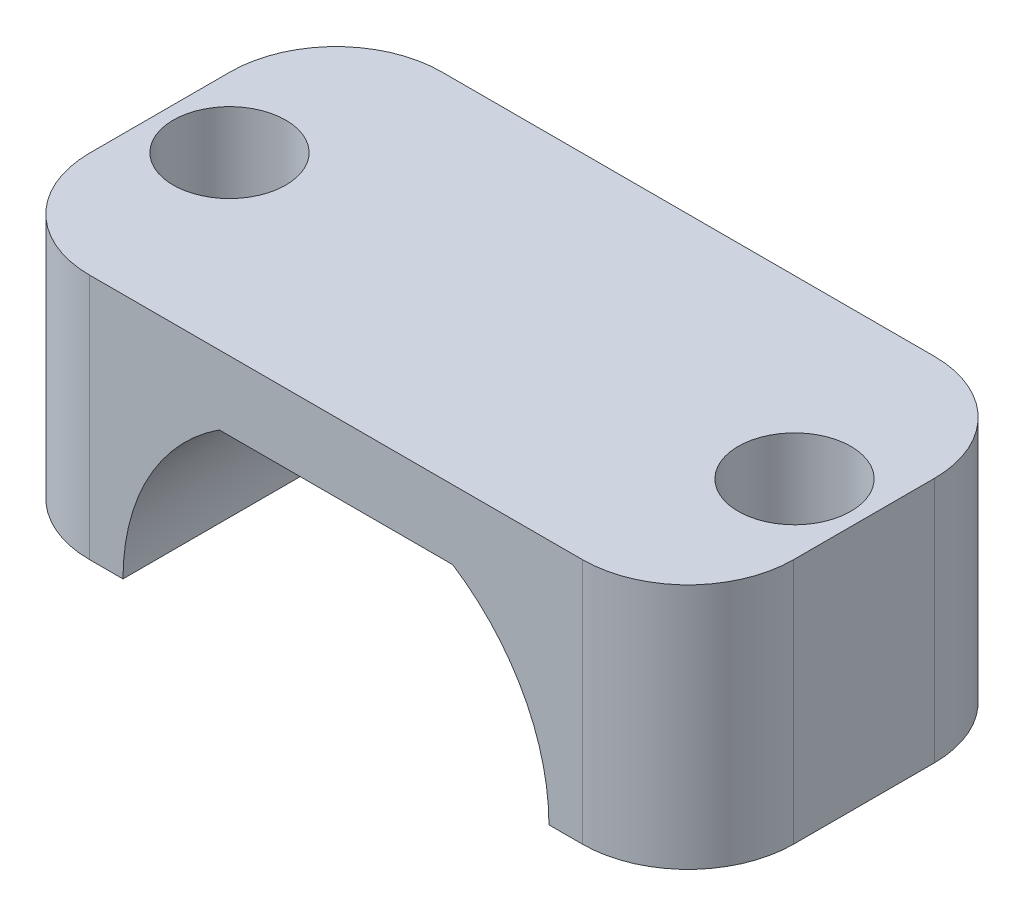
ISO-10303-21;
HEADER;
FILE_DESCRIPTION(('STEP AP214'),'2;1');
FILE_NAME('part.step','',(''),(''),'','','');
FILE_SCHEMA(('AUTOMOTIVE_DESIGN { 1 0 10303 214 1 1 1 1 }'));
ENDSEC;
DATA;
#1=APPLICATION_CONTEXT('core data for automotive mechanical design processes');
#2=APPLICATION_PROTOCOL_DEFINITION('international standard','automotive_design',2000,#1);
#3=PRODUCT_CONTEXT('',#1,'mechanical');
#4=PRODUCT('Part','Part','',(#3));
#5=PRODUCT_RELATED_PRODUCT_CATEGORY('part','',(#4));
#6=PRODUCT_DEFINITION_FORMATION('','',#4);
#7=PRODUCT_DEFINITION_CONTEXT('part definition',#1,'design');
#8=PRODUCT_DEFINITION('design','',#6,#7);
#9=PRODUCT_DEFINITION_SHAPE('','',#8);
#10=(LENGTH_UNIT() NAMED_UNIT(*) SI_UNIT(.MILLI.,.METRE.));
#11=(NAMED_UNIT(*) PLANE_ANGLE_UNIT() SI_UNIT($,.RADIAN.));
#12=(NAMED_UNIT(*) SI_UNIT($,.STERADIAN.) SOLID_ANGLE_UNIT());
#13=UNCERTAINTY_MEASURE_WITH_UNIT(LENGTH_MEASURE(1.E-05),#10,'distance_accuracy_value','');
#14=(GEOMETRIC_REPRESENTATION_CONTEXT(3) GLOBAL_UNCERTAINTY_ASSIGNED_CONTEXT((#13)) GLOBAL_UNIT_ASSIGNED_CONTEXT((#10,
#11,#12)) REPRESENTATION_CONTEXT('',''));
#15=CARTESIAN_POINT('',(0.,0.,0.));
#16=DIRECTION('',(0.,0.,1.));
#17=DIRECTION('',(1.,0.,0.));
#18=AXIS2_PLACEMENT_3D('',#15,#16,#17);
#19=CARTESIAN_POINT('',(10.,0.,5.));
#20=DIRECTION('',(-1.,0.,0.));
#21=DIRECTION('',(0.,-1.,0.));
#22=AXIS2_PLACEMENT_3D('',#19,#20,#21);
#23=PLANE('',#22);
#24=DIRECTION('',(0.,0.,-1.));
#25=VECTOR('',#24,1.);
#26=CARTESIAN_POINT('',(10.,-7.,5.));
#27=LINE('',#26,#25);
#28=CARTESIAN_POINT('',(10.,-7.,2.));
#29=VERTEX_POINT('',#28);
#30=CARTESIAN_POINT('',(10.,-7.,-2.));
#31=VERTEX_POINT('',#30);
#32=EDGE_CURVE('E167',#29,#31,#27,.T.);
#33=ORIENTED_EDGE('',*,*,#32,.T.);
#34=DIRECTION('',(0.,1.,0.));
#35=VECTOR('',#34,1.);
#36=CARTESIAN_POINT('',(10.,0.,-2.));
#37=LINE('',#36,#35);
#38=CARTESIAN_POINT('',(10.,0.,-2.));
#39=VERTEX_POINT('',#38);
#40=EDGE_CURVE('E214',#31,#39,#37,.T.);
#41=ORIENTED_EDGE('',*,*,#40,.T.);
#42=DIRECTION('',(0.,0.,-1.));
#43=VECTOR('',#42,1.);
#44=CARTESIAN_POINT('',(10.,0.,5.));
#45=LINE('',#44,#43);
#46=CARTESIAN_POINT('',(10.,0.,2.));
#47=VERTEX_POINT('',#46);
#48=EDGE_CURVE('E207',#47,#39,#45,.T.);
#49=ORIENTED_EDGE('',*,*,#48,.F.);
#50=DIRECTION('',(0.,1.,0.));
#51=VECTOR('',#50,1.);
#52=CARTESIAN_POINT('',(10.,-7.,2.));
#53=LINE('',#52,#51);
#54=EDGE_CURVE('E211',#47,#29,#53,.F.);
#55=ORIENTED_EDGE('',*,*,#54,.T.);
#56=EDGE_LOOP('',(#33,#41,#49,#55));
#57=FACE_BOUND('',#56,.T.);
#58=ADVANCED_FACE('F39',(#57),#23,.F.);
#59=CARTESIAN_POINT('',(-10.,0.,5.));
#60=DIRECTION('',(0.,-1.,0.));
#61=DIRECTION('',(0.,0.,-1.));
#62=AXIS2_PLACEMENT_3D('',#59,#60,#61);
#63=PLANE('',#62);
#64=CARTESIAN_POINT('',(8.025,0.,0.));
#65=DIRECTION('',(0.,-1.,0.));
#66=DIRECTION('',(0.,0.,-1.));
#67=AXIS2_PLACEMENT_3D('',#64,#65,#66);
#68=CIRCLE('',#67,1.6);
#69=CARTESIAN_POINT('',(8.025,0.,-1.6));
#70=VERTEX_POINT('',#69);
#71=EDGE_CURVE('E172',#70,#70,#68,.T.);
#72=ORIENTED_EDGE('',*,*,#71,.T.);
#73=EDGE_LOOP('',(#72));
#74=FACE_BOUND('',#73,.T.);
#75=CARTESIAN_POINT('',(-8.025,0.,0.));
#76=DIRECTION('',(0.,-1.,0.));
#77=DIRECTION('',(0.,0.,-1.));
#78=AXIS2_PLACEMENT_3D('',#75,#76,#77);
#79=CIRCLE('',#78,1.6);
#80=CARTESIAN_POINT('',(-8.025,0.,-1.6));
#81=VERTEX_POINT('',#80);
#82=EDGE_CURVE('E327',#81,#81,#79,.T.);
#83=ORIENTED_EDGE('',*,*,#82,.T.);
#84=EDGE_LOOP('',(#83));
#85=FACE_BOUND('',#84,.T.);
#86=ORIENTED_EDGE('',*,*,#48,.T.);
#87=CARTESIAN_POINT('',(7.,0.,-2.));
#88=DIRECTION('',(0.,-1.,0.));
#89=DIRECTION('',(0.,0.,-1.));
#90=AXIS2_PLACEMENT_3D('',#87,#88,#89);
#91=CIRCLE('',#90,3.);
#92=CARTESIAN_POINT('',(7.,0.,-5.));
#93=VERTEX_POINT('',#92);
#94=EDGE_CURVE('E227',#39,#93,#91,.F.);
#95=ORIENTED_EDGE('',*,*,#94,.T.);
#96=DIRECTION('',(-1.,0.,0.));
#97=VECTOR('',#96,1.);
#98=CARTESIAN_POINT('',(-10.,0.,-5.));
#99=LINE('',#98,#97);
#100=CARTESIAN_POINT('',(-7.,0.,-5.));
#101=VERTEX_POINT('',#100);
#102=EDGE_CURVE('E168',#93,#101,#99,.T.);
#103=ORIENTED_EDGE('',*,*,#102,.T.);
#104=CARTESIAN_POINT('',(-7.,0.,-2.));
#105=DIRECTION('',(0.,-1.,0.));
#106=DIRECTION('',(0.,0.,-1.));
#107=AXIS2_PLACEMENT_3D('',#104,#105,#106);
#108=CIRCLE('',#107,3.);
#109=CARTESIAN_POINT('',(-10.,0.,-2.));
#110=VERTEX_POINT('',#109);
#111=EDGE_CURVE('E221',#101,#110,#108,.F.);
#112=ORIENTED_EDGE('',*,*,#111,.T.);
#113=DIRECTION('',(0.,0.,-1.));
#114=VECTOR('',#113,1.);
#115=CARTESIAN_POINT('',(-10.,0.,5.));
#116=LINE('',#115,#114);
#117=CARTESIAN_POINT('',(-10.,0.,2.));
#118=VERTEX_POINT('',#117);
#119=EDGE_CURVE('E203',#118,#110,#116,.T.);
#120=ORIENTED_EDGE('',*,*,#119,.F.);
#121=CARTESIAN_POINT('',(-7.,0.,2.));
#122=DIRECTION('',(0.,-1.,0.));
#123=DIRECTION('',(0.,0.,-1.));
#124=AXIS2_PLACEMENT_3D('',#121,#122,#123);
#125=CIRCLE('',#124,3.);
#126=CARTESIAN_POINT('',(-7.,0.,5.));
#127=VERTEX_POINT('',#126);
#128=EDGE_CURVE('E218',#118,#127,#125,.F.);
#129=ORIENTED_EDGE('',*,*,#128,.T.);
#130=DIRECTION('',(-1.,0.,0.));
#131=VECTOR('',#130,1.);
#132=CARTESIAN_POINT('',(-10.,0.,5.));
#133=LINE('',#132,#131);
#134=CARTESIAN_POINT('',(7.,0.,5.));
#135=VERTEX_POINT('',#134);
#136=EDGE_CURVE('E138',#135,#127,#133,.T.);
#137=ORIENTED_EDGE('',*,*,#136,.F.);
#138=CARTESIAN_POINT('',(7.,0.,2.));
#139=DIRECTION('',(0.,-1.,0.));
#140=DIRECTION('',(0.,0.,-1.));
#141=AXIS2_PLACEMENT_3D('',#138,#139,#140);
#142=CIRCLE('',#141,3.);
#143=EDGE_CURVE('E224',#135,#47,#142,.F.);
#144=ORIENTED_EDGE('',*,*,#143,.T.);
#145=EDGE_LOOP('',(#86,#95,#103,#112,#120,#129,#137,#144));
#146=FACE_BOUND('',#145,.T.);
#147=ADVANCED_FACE('F265',(#74,#85,#146),#63,.F.);
#148=CARTESIAN_POINT('',(-10.,-7.,5.));
#149=DIRECTION('',(1.,0.,0.));
#150=DIRECTION('',(0.,1.,0.));
#151=AXIS2_PLACEMENT_3D('',#148,#149,#150);
#152=PLANE('',#151);
#153=ORIENTED_EDGE('',*,*,#119,.T.);
#154=DIRECTION('',(0.,-1.,0.));
#155=VECTOR('',#154,1.);
#156=CARTESIAN_POINT('',(-10.,-7.,-2.));
#157=LINE('',#156,#155);
#158=CARTESIAN_POINT('',(-10.,-7.,-2.));
#159=VERTEX_POINT('',#158);
#160=EDGE_CURVE('E251',#110,#159,#157,.T.);
#161=ORIENTED_EDGE('',*,*,#160,.T.);
#162=DIRECTION('',(0.,0.,-1.));
#163=VECTOR('',#162,1.);
#164=CARTESIAN_POINT('',(-10.,-7.,5.));
#165=LINE('',#164,#163);
#166=CARTESIAN_POINT('',(-10.,-7.,2.));
#167=VERTEX_POINT('',#166);
#168=EDGE_CURVE('E148',#167,#159,#165,.T.);
#169=ORIENTED_EDGE('',*,*,#168,.F.);
#170=DIRECTION('',(0.,-1.,0.));
#171=VECTOR('',#170,1.);
#172=CARTESIAN_POINT('',(-10.,0.,2.));
#173=LINE('',#172,#171);
#174=EDGE_CURVE('E248',#167,#118,#173,.F.);
#175=ORIENTED_EDGE('',*,*,#174,.T.);
#176=EDGE_LOOP('',(#153,#161,#169,#175));
#177=FACE_BOUND('',#176,.T.);
#178=ADVANCED_FACE('F255',(#177),#152,.F.);
#179=CARTESIAN_POINT('',(-6.05,-7.,5.));
#180=DIRECTION('',(0.,1.,0.));
#181=DIRECTION('',(0.,0.,1.));
#182=AXIS2_PLACEMENT_3D('',#179,#180,#181);
#183=PLANE('',#182);
#184=CARTESIAN_POINT('',(-8.025,-7.,0.));
#185=DIRECTION('',(0.,-1.,0.));
#186=DIRECTION('',(0.,0.,-1.));
#187=AXIS2_PLACEMENT_3D('',#184,#185,#186);
#188=CIRCLE('',#187,1.6);
#189=CARTESIAN_POINT('',(-8.025,-7.,-1.6));
#190=VERTEX_POINT('',#189);
#191=EDGE_CURVE('E323',#190,#190,#188,.T.);
#192=ORIENTED_EDGE('',*,*,#191,.F.);
#193=EDGE_LOOP('',(#192));
#194=FACE_BOUND('',#193,.T.);
#195=ORIENTED_EDGE('',*,*,#168,.T.);
#196=CARTESIAN_POINT('',(-7.,-7.,-2.));
#197=DIRECTION('',(0.,1.,0.));
#198=DIRECTION('',(0.,0.,1.));
#199=AXIS2_PLACEMENT_3D('',#196,#197,#198);
#200=CIRCLE('',#199,3.);
#201=CARTESIAN_POINT('',(-7.,-7.,-5.));
#202=VERTEX_POINT('',#201);
#203=EDGE_CURVE('E11',#159,#202,#200,.F.);
#204=ORIENTED_EDGE('',*,*,#203,.T.);
#205=DIRECTION('',(1.,0.,0.));
#206=VECTOR('',#205,1.);
#207=CARTESIAN_POINT('',(-6.05,-7.,-5.));
#208=LINE('',#207,#206);
#209=CARTESIAN_POINT('',(-6.05,-7.,-5.));
#210=VERTEX_POINT('',#209);
#211=EDGE_CURVE('E144',#202,#210,#208,.T.);
#212=ORIENTED_EDGE('',*,*,#211,.T.);
#213=DIRECTION('',(0.,0.,-1.));
#214=VECTOR('',#213,1.);
#215=CARTESIAN_POINT('',(-6.05,-7.,5.));
#216=LINE('',#215,#214);
#217=CARTESIAN_POINT('',(-6.05,-7.,5.));
#218=VERTEX_POINT('',#217);
#219=EDGE_CURVE('E141',#218,#210,#216,.T.);
#220=ORIENTED_EDGE('',*,*,#219,.F.);
#221=DIRECTION('',(1.,0.,0.));
#222=VECTOR('',#221,1.);
#223=CARTESIAN_POINT('',(-6.05,-7.,5.));
#224=LINE('',#223,#222);
#225=CARTESIAN_POINT('',(-7.,-7.,5.));
#226=VERTEX_POINT('',#225);
#227=EDGE_CURVE('E127',#226,#218,#224,.T.);
#228=ORIENTED_EDGE('',*,*,#227,.F.);
#229=CARTESIAN_POINT('',(-7.,-7.,2.));
#230=DIRECTION('',(0.,1.,0.));
#231=DIRECTION('',(0.,0.,1.));
#232=AXIS2_PLACEMENT_3D('',#229,#230,#231);
#233=CIRCLE('',#232,3.);
#234=EDGE_CURVE('E48',#226,#167,#233,.F.);
#235=ORIENTED_EDGE('',*,*,#234,.T.);
#236=EDGE_LOOP('',(#195,#204,#212,#220,#228,#235));
#237=FACE_BOUND('',#236,.T.);
#238=ADVANCED_FACE('F142',(#194,#237),#183,.F.);
#239=CARTESIAN_POINT('',(-0.0499999999999997,-7.,5.));
#240=DIRECTION('',(0.,0.,-1.));
#241=DIRECTION('',(-1.,0.,0.));
#242=AXIS2_PLACEMENT_3D('',#239,#240,#241);
#243=CYLINDRICAL_SURFACE('',#242,6.);
#244=CARTESIAN_POINT('',(-0.0499999999999997,-7.,-5.));
#245=DIRECTION('',(0.,0.,-1.));
#246=DIRECTION('',(1.,0.,0.));
#247=AXIS2_PLACEMENT_3D('',#244,#245,#246);
#248=CIRCLE('',#247,6.);
#249=CARTESIAN_POINT('',(-3.315,-1.96613716913144,-5.));
#250=VERTEX_POINT('',#249);
#251=EDGE_CURVE('E175',#210,#250,#248,.T.);
#252=ORIENTED_EDGE('',*,*,#251,.T.);
#253=DIRECTION('',(0.,0.,-1.));
#254=VECTOR('',#253,1.);
#255=CARTESIAN_POINT('',(-3.315,-1.96613716913144,5.));
#256=LINE('',#255,#254);
#257=CARTESIAN_POINT('',(-3.315,-1.96613716913144,5.));
#258=VERTEX_POINT('',#257);
#259=EDGE_CURVE('E149',#258,#250,#256,.T.);
#260=ORIENTED_EDGE('',*,*,#259,.F.);
#261=CARTESIAN_POINT('',(-0.0499999999999997,-7.,5.));
#262=DIRECTION('',(0.,0.,-1.));
#263=DIRECTION('',(1.,0.,0.));
#264=AXIS2_PLACEMENT_3D('',#261,#262,#263);
#265=CIRCLE('',#264,6.);
#266=EDGE_CURVE('E132',#218,#258,#265,.T.);
#267=ORIENTED_EDGE('',*,*,#266,.F.);
#268=ORIENTED_EDGE('',*,*,#219,.T.);
#269=EDGE_LOOP('',(#252,#260,#267,#268));
#270=FACE_BOUND('',#269,.T.);
#271=ADVANCED_FACE('F151',(#270),#243,.F.);
#272=CARTESIAN_POINT('',(3.315,-1.96613716913144,5.));
#273=DIRECTION('',(0.,1.,0.));
#274=DIRECTION('',(0.,0.,1.));
#275=AXIS2_PLACEMENT_3D('',#272,#273,#274);
#276=PLANE('',#275);
#277=DIRECTION('',(1.,0.,0.));
#278=VECTOR('',#277,1.);
#279=CARTESIAN_POINT('',(3.315,-1.96613716913144,-5.));
#280=LINE('',#279,#278);
#281=CARTESIAN_POINT('',(3.315,-1.96613716913144,-5.));
#282=VERTEX_POINT('',#281);
#283=EDGE_CURVE('E178',#250,#282,#280,.T.);
#284=ORIENTED_EDGE('',*,*,#283,.T.);
#285=DIRECTION('',(0.,0.,-1.));
#286=VECTOR('',#285,1.);
#287=CARTESIAN_POINT('',(3.315,-1.96613716913144,5.));
#288=LINE('',#287,#286);
#289=CARTESIAN_POINT('',(3.315,-1.96613716913144,5.));
#290=VERTEX_POINT('',#289);
#291=EDGE_CURVE('E195',#290,#282,#288,.T.);
#292=ORIENTED_EDGE('',*,*,#291,.F.);
#293=DIRECTION('',(1.,0.,0.));
#294=VECTOR('',#293,1.);
#295=CARTESIAN_POINT('',(3.315,-1.96613716913144,5.));
#296=LINE('',#295,#294);
#297=EDGE_CURVE('E155',#258,#290,#296,.T.);
#298=ORIENTED_EDGE('',*,*,#297,.F.);
#299=ORIENTED_EDGE('',*,*,#259,.T.);
#300=EDGE_LOOP('',(#284,#292,#298,#299));
#301=FACE_BOUND('',#300,.T.);
#302=ADVANCED_FACE('F292',(#301),#276,.F.);
#303=CARTESIAN_POINT('',(0.0499999999999997,-7.,5.));
#304=DIRECTION('',(0.,0.,-1.));
#305=DIRECTION('',(-1.,0.,0.));
#306=AXIS2_PLACEMENT_3D('',#303,#304,#305);
#307=CYLINDRICAL_SURFACE('',#306,6.);
#308=CARTESIAN_POINT('',(0.0499999999999997,-7.,-5.));
#309=DIRECTION('',(0.,0.,-1.));
#310=DIRECTION('',(1.,0.,0.));
#311=AXIS2_PLACEMENT_3D('',#308,#309,#310);
#312=CIRCLE('',#311,6.);
#313=CARTESIAN_POINT('',(6.05,-7.,-5.));
#314=VERTEX_POINT('',#313);
#315=EDGE_CURVE('E181',#282,#314,#312,.T.);
#316=ORIENTED_EDGE('',*,*,#315,.T.);
#317=DIRECTION('',(0.,0.,-1.));
#318=VECTOR('',#317,1.);
#319=CARTESIAN_POINT('',(6.05,-7.,5.));
#320=LINE('',#319,#318);
#321=CARTESIAN_POINT('',(6.05,-7.,5.));
#322=VERTEX_POINT('',#321);
#323=EDGE_CURVE('E191',#322,#314,#320,.T.);
#324=ORIENTED_EDGE('',*,*,#323,.F.);
#325=CARTESIAN_POINT('',(0.0499999999999997,-7.,5.));
#326=DIRECTION('',(0.,0.,-1.));
#327=DIRECTION('',(1.,0.,0.));
#328=AXIS2_PLACEMENT_3D('',#325,#326,#327);
#329=CIRCLE('',#328,6.);
#330=EDGE_CURVE('E158',#290,#322,#329,.T.);
#331=ORIENTED_EDGE('',*,*,#330,.F.);
#332=ORIENTED_EDGE('',*,*,#291,.T.);
#333=EDGE_LOOP('',(#316,#324,#331,#332));
#334=FACE_BOUND('',#333,.T.);
#335=ADVANCED_FACE('F289',(#334),#307,.F.);
#336=CARTESIAN_POINT('',(10.,-7.,5.));
#337=DIRECTION('',(0.,1.,0.));
#338=DIRECTION('',(0.,0.,1.));
#339=AXIS2_PLACEMENT_3D('',#336,#337,#338);
#340=PLANE('',#339);
#341=CARTESIAN_POINT('',(8.025,-7.,0.));
#342=DIRECTION('',(0.,-1.,0.));
#343=DIRECTION('',(0.,0.,-1.));
#344=AXIS2_PLACEMENT_3D('',#341,#342,#343);
#345=CIRCLE('',#344,1.6);
#346=CARTESIAN_POINT('',(8.025,-7.,-1.6));
#347=VERTEX_POINT('',#346);
#348=EDGE_CURVE('E331',#347,#347,#345,.T.);
#349=ORIENTED_EDGE('',*,*,#348,.F.);
#350=EDGE_LOOP('',(#349));
#351=FACE_BOUND('',#350,.T.);
#352=DIRECTION('',(1.,0.,0.));
#353=VECTOR('',#352,1.);
#354=CARTESIAN_POINT('',(10.,-7.,-5.));
#355=LINE('',#354,#353);
#356=CARTESIAN_POINT('',(7.,-7.,-5.));
#357=VERTEX_POINT('',#356);
#358=EDGE_CURVE('E184',#314,#357,#355,.T.);
#359=ORIENTED_EDGE('',*,*,#358,.T.);
#360=CARTESIAN_POINT('',(7.,-7.,-2.));
#361=DIRECTION('',(0.,1.,0.));
#362=DIRECTION('',(0.,0.,1.));
#363=AXIS2_PLACEMENT_3D('',#360,#361,#362);
#364=CIRCLE('',#363,3.);
#365=EDGE_CURVE('E239',#357,#31,#364,.F.);
#366=ORIENTED_EDGE('',*,*,#365,.T.);
#367=ORIENTED_EDGE('',*,*,#32,.F.);
#368=CARTESIAN_POINT('',(7.,-7.,2.));
#369=DIRECTION('',(0.,1.,0.));
#370=DIRECTION('',(0.,0.,1.));
#371=AXIS2_PLACEMENT_3D('',#368,#369,#370);
#372=CIRCLE('',#371,3.);
#373=CARTESIAN_POINT('',(7.,-7.,5.));
#374=VERTEX_POINT('',#373);
#375=EDGE_CURVE('E236',#29,#374,#372,.F.);
#376=ORIENTED_EDGE('',*,*,#375,.T.);
#377=DIRECTION('',(1.,0.,0.));
#378=VECTOR('',#377,1.);
#379=CARTESIAN_POINT('',(10.,-7.,5.));
#380=LINE('',#379,#378);
#381=EDGE_CURVE('E164',#322,#374,#380,.T.);
#382=ORIENTED_EDGE('',*,*,#381,.F.);
#383=ORIENTED_EDGE('',*,*,#323,.T.);
#384=EDGE_LOOP('',(#359,#366,#367,#376,#382,#383));
#385=FACE_BOUND('',#384,.T.);
#386=ADVANCED_FACE('F275',(#351,#385),#340,.F.);
#387=CARTESIAN_POINT('',(0.0499999999999997,-7.,5.));
#388=DIRECTION('',(0.,0.,1.));
#389=DIRECTION('',(1.,0.,0.));
#390=AXIS2_PLACEMENT_3D('',#387,#388,#389);
#391=PLANE('',#390);
#392=ORIENTED_EDGE('',*,*,#381,.T.);
#393=DIRECTION('',(0.,1.,0.));
#394=VECTOR('',#393,1.);
#395=CARTESIAN_POINT('',(7.,0.,5.));
#396=LINE('',#395,#394);
#397=EDGE_CURVE('E244',#374,#135,#396,.T.);
#398=ORIENTED_EDGE('',*,*,#397,.T.);
#399=ORIENTED_EDGE('',*,*,#136,.T.);
#400=DIRECTION('',(0.,-1.,0.));
#401=VECTOR('',#400,1.);
#402=CARTESIAN_POINT('',(-7.,-7.,5.));
#403=LINE('',#402,#401);
#404=EDGE_CURVE('E136',#127,#226,#403,.T.);
#405=ORIENTED_EDGE('',*,*,#404,.T.);
#406=ORIENTED_EDGE('',*,*,#227,.T.);
#407=ORIENTED_EDGE('',*,*,#266,.T.);
#408=ORIENTED_EDGE('',*,*,#297,.T.);
#409=ORIENTED_EDGE('',*,*,#330,.T.);
#410=EDGE_LOOP('',(#392,#398,#399,#405,#406,#407,#408,#409));
#411=FACE_BOUND('',#410,.T.);
#412=ADVANCED_FACE('F130',(#411),#391,.T.);
#413=CARTESIAN_POINT('',(0.0499999999999997,-7.,-5.));
#414=DIRECTION('',(0.,0.,1.));
#415=DIRECTION('',(1.,0.,0.));
#416=AXIS2_PLACEMENT_3D('',#413,#414,#415);
#417=PLANE('',#416);
#418=ORIENTED_EDGE('',*,*,#102,.F.);
#419=DIRECTION('',(0.,1.,0.));
#420=VECTOR('',#419,1.);
#421=CARTESIAN_POINT('',(7.,-7.,-5.));
#422=LINE('',#421,#420);
#423=EDGE_CURVE('E233',#93,#357,#422,.F.);
#424=ORIENTED_EDGE('',*,*,#423,.T.);
#425=ORIENTED_EDGE('',*,*,#358,.F.);
#426=ORIENTED_EDGE('',*,*,#315,.F.);
#427=ORIENTED_EDGE('',*,*,#283,.F.);
#428=ORIENTED_EDGE('',*,*,#251,.F.);
#429=ORIENTED_EDGE('',*,*,#211,.F.);
#430=DIRECTION('',(0.,-1.,0.));
#431=VECTOR('',#430,1.);
#432=CARTESIAN_POINT('',(-7.,-7.,-5.));
#433=LINE('',#432,#431);
#434=EDGE_CURVE('E230',#202,#101,#433,.F.);
#435=ORIENTED_EDGE('',*,*,#434,.T.);
#436=EDGE_LOOP('',(#418,#424,#425,#426,#427,#428,#429,#435));
#437=FACE_BOUND('',#436,.T.);
#438=ADVANCED_FACE('F261',(#437),#417,.F.);
#439=CARTESIAN_POINT('',(8.025,0.,0.));
#440=DIRECTION('',(0.,-1.,0.));
#441=DIRECTION('',(0.,0.,-1.));
#442=AXIS2_PLACEMENT_3D('',#439,#440,#441);
#443=CYLINDRICAL_SURFACE('',#442,1.6);
#444=ORIENTED_EDGE('',*,*,#71,.F.);
#445=EDGE_LOOP('',(#444));
#446=FACE_BOUND('',#445,.T.);
#447=ORIENTED_EDGE('',*,*,#348,.T.);
#448=EDGE_LOOP('',(#447));
#449=FACE_BOUND('',#448,.T.);
#450=ADVANCED_FACE('F340',(#446,#449),#443,.F.);
#451=CARTESIAN_POINT('',(-8.025,0.,0.));
#452=DIRECTION('',(0.,-1.,0.));
#453=DIRECTION('',(0.,0.,-1.));
#454=AXIS2_PLACEMENT_3D('',#451,#452,#453);
#455=CYLINDRICAL_SURFACE('',#454,1.6);
#456=ORIENTED_EDGE('',*,*,#82,.F.);
#457=EDGE_LOOP('',(#456));
#458=FACE_BOUND('',#457,.T.);
#459=ORIENTED_EDGE('',*,*,#191,.T.);
#460=EDGE_LOOP('',(#459));
#461=FACE_BOUND('',#460,.T.);
#462=ADVANCED_FACE('F312',(#458,#461),#455,.F.);
#463=CARTESIAN_POINT('',(7.,0.,-2.));
#464=DIRECTION('',(0.,1.,0.));
#465=DIRECTION('',(-1.,0.,0.));
#466=AXIS2_PLACEMENT_3D('',#463,#464,#465);
#467=CYLINDRICAL_SURFACE('',#466,3.);
#468=ORIENTED_EDGE('',*,*,#365,.F.);
#469=ORIENTED_EDGE('',*,*,#423,.F.);
#470=ORIENTED_EDGE('',*,*,#94,.F.);
#471=ORIENTED_EDGE('',*,*,#40,.F.);
#472=EDGE_LOOP('',(#468,#469,#470,#471));
#473=FACE_BOUND('',#472,.T.);
#474=ADVANCED_FACE('F271',(#473),#467,.T.);
#475=CARTESIAN_POINT('',(7.,-7.,2.));
#476=DIRECTION('',(0.,-1.,0.));
#477=DIRECTION('',(1.,0.,0.));
#478=AXIS2_PLACEMENT_3D('',#475,#476,#477);
#479=CYLINDRICAL_SURFACE('',#478,3.);
#480=ORIENTED_EDGE('',*,*,#375,.F.);
#481=ORIENTED_EDGE('',*,*,#54,.F.);
#482=ORIENTED_EDGE('',*,*,#143,.F.);
#483=ORIENTED_EDGE('',*,*,#397,.F.);
#484=EDGE_LOOP('',(#480,#481,#482,#483));
#485=FACE_BOUND('',#484,.T.);
#486=ADVANCED_FACE('F281',(#485),#479,.T.);
#487=CARTESIAN_POINT('',(-7.,-7.,-2.));
#488=DIRECTION('',(0.,-1.,0.));
#489=DIRECTION('',(1.,0.,0.));
#490=AXIS2_PLACEMENT_3D('',#487,#488,#489);
#491=CYLINDRICAL_SURFACE('',#490,3.);
#492=ORIENTED_EDGE('',*,*,#111,.F.);
#493=ORIENTED_EDGE('',*,*,#434,.F.);
#494=ORIENTED_EDGE('',*,*,#203,.F.);
#495=ORIENTED_EDGE('',*,*,#160,.F.);
#496=EDGE_LOOP('',(#492,#493,#494,#495));
#497=FACE_BOUND('',#496,.T.);
#498=ADVANCED_FACE('F263',(#497),#491,.T.);
#499=CARTESIAN_POINT('',(-7.,-7.,2.));
#500=DIRECTION('',(0.,1.,0.));
#501=DIRECTION('',(-1.,0.,0.));
#502=AXIS2_PLACEMENT_3D('',#499,#500,#501);
#503=CYLINDRICAL_SURFACE('',#502,3.);
#504=ORIENTED_EDGE('',*,*,#128,.F.);
#505=ORIENTED_EDGE('',*,*,#174,.F.);
#506=ORIENTED_EDGE('',*,*,#234,.F.);
#507=ORIENTED_EDGE('',*,*,#404,.F.);
#508=EDGE_LOOP('',(#504,#505,#506,#507));
#509=FACE_BOUND('',#508,.T.);
#510=ADVANCED_FACE('F41',(#509),#503,.T.);
#511=CLOSED_SHELL('',(#58,#147,#178,#238,#271,#302,#335,#386,#412,#438,#450,#462,#474,#486,#498,#510));
#512=MANIFOLD_SOLID_BREP('B2',#511);
#513=ADVANCED_BREP_SHAPE_REPRESENTATION('',(#18,#512),#14);
#514=SHAPE_DEFINITION_REPRESENTATION(#9,#513);
ENDSEC;
END-ISO-10303-21;
